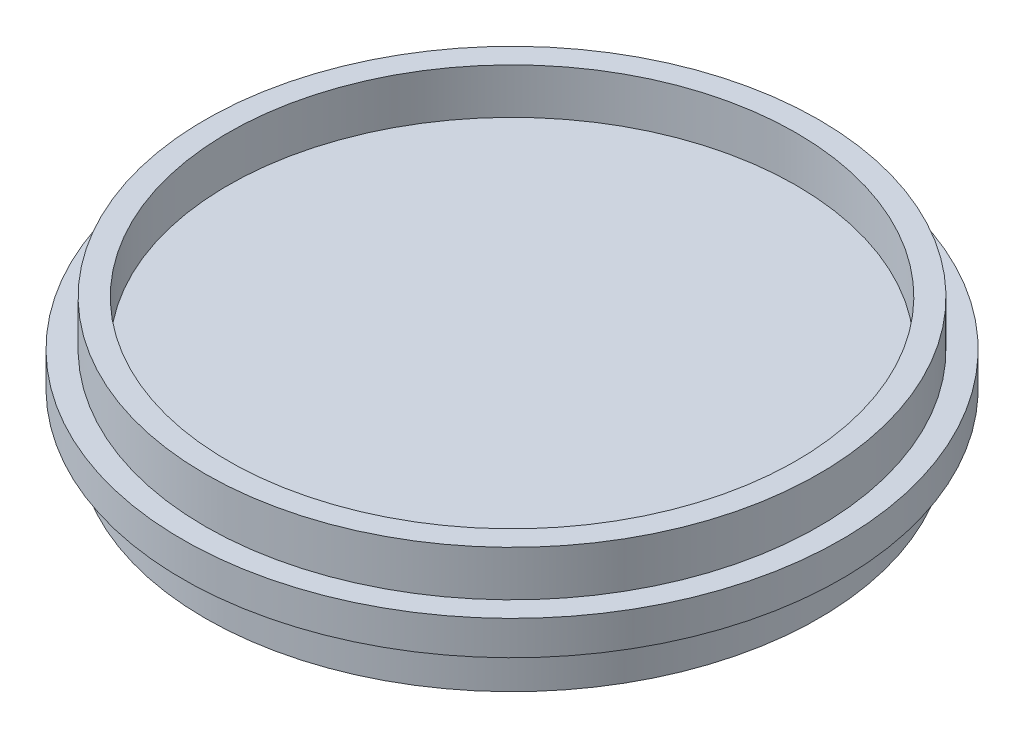
ISO-10303-21;
HEADER;
FILE_DESCRIPTION(('STEP AP214'),'2;1');
FILE_NAME('part.step','',(''),(''),'','','');
FILE_SCHEMA(('AUTOMOTIVE_DESIGN { 1 0 10303 214 1 1 1 1 }'));
ENDSEC;
DATA;
#1=APPLICATION_CONTEXT('core data for automotive mechanical design processes');
#2=APPLICATION_PROTOCOL_DEFINITION('international standard','automotive_design',2000,#1);
#3=PRODUCT_CONTEXT('',#1,'mechanical');
#4=PRODUCT('Part','Part','',(#3));
#5=PRODUCT_RELATED_PRODUCT_CATEGORY('part','',(#4));
#6=PRODUCT_DEFINITION_FORMATION('','',#4);
#7=PRODUCT_DEFINITION_CONTEXT('part definition',#1,'design');
#8=PRODUCT_DEFINITION('design','',#6,#7);
#9=PRODUCT_DEFINITION_SHAPE('','',#8);
#10=(LENGTH_UNIT() NAMED_UNIT(*) SI_UNIT(.MILLI.,.METRE.));
#11=(NAMED_UNIT(*) PLANE_ANGLE_UNIT() SI_UNIT($,.RADIAN.));
#12=(NAMED_UNIT(*) SI_UNIT($,.STERADIAN.) SOLID_ANGLE_UNIT());
#13=UNCERTAINTY_MEASURE_WITH_UNIT(LENGTH_MEASURE(1.E-05),#10,'distance_accuracy_value','');
#14=(GEOMETRIC_REPRESENTATION_CONTEXT(3) GLOBAL_UNCERTAINTY_ASSIGNED_CONTEXT((#13)) GLOBAL_UNIT_ASSIGNED_CONTEXT((#10,
#11,#12)) REPRESENTATION_CONTEXT('',''));
#15=CARTESIAN_POINT('',(0.,0.,0.));
#16=DIRECTION('',(0.,0.,1.));
#17=DIRECTION('',(1.,0.,0.));
#18=AXIS2_PLACEMENT_3D('',#15,#16,#17);
#19=CARTESIAN_POINT('',(63.8175,269.952427511005,-63.8175));
#20=DIRECTION('',(0.,-1.,0.));
#21=DIRECTION('',(0.,0.,-1.));
#22=AXIS2_PLACEMENT_3D('',#19,#20,#21);
#23=CYLINDRICAL_SURFACE('',#22,92.075);
#24=CARTESIAN_POINT('',(63.8175,9.52500000000001,-63.8175));
#25=DIRECTION('',(0.,-1.,0.));
#26=DIRECTION('',(0.,0.,-1.));
#27=AXIS2_PLACEMENT_3D('',#24,#25,#26);
#28=CIRCLE('',#27,92.075);
#29=CARTESIAN_POINT('',(63.8175,9.52500000000001,-155.8925));
#30=VERTEX_POINT('',#29);
#31=EDGE_CURVE('E52',#30,#30,#28,.F.);
#32=ORIENTED_EDGE('',*,*,#31,.F.);
#33=EDGE_LOOP('',(#32));
#34=FACE_BOUND('',#33,.T.);
#35=CARTESIAN_POINT('',(63.8175,0.,-63.8175));
#36=DIRECTION('',(0.,-1.,0.));
#37=DIRECTION('',(0.,0.,-1.));
#38=AXIS2_PLACEMENT_3D('',#35,#36,#37);
#39=CIRCLE('',#38,92.075);
#40=CARTESIAN_POINT('',(63.8175,0.,-155.8925));
#41=VERTEX_POINT('',#40);
#42=EDGE_CURVE('E57',#41,#41,#39,.T.);
#43=ORIENTED_EDGE('',*,*,#42,.F.);
#44=EDGE_LOOP('',(#43));
#45=FACE_BOUND('',#44,.T.);
#46=ADVANCED_FACE('F39',(#34,#45),#23,.T.);
#47=CARTESIAN_POINT('',(0.,9.525,0.));
#48=DIRECTION('',(0.,-1.,0.));
#49=DIRECTION('',(0.,0.,-1.));
#50=AXIS2_PLACEMENT_3D('',#47,#48,#49);
#51=PLANE('',#50);
#52=CARTESIAN_POINT('',(63.8175,9.525,-63.8175));
#53=DIRECTION('',(0.,-1.,0.));
#54=DIRECTION('',(0.,0.,-1.));
#55=AXIS2_PLACEMENT_3D('',#52,#53,#54);
#56=CIRCLE('',#55,85.725);
#57=CARTESIAN_POINT('',(63.8175,9.525,-149.5425));
#58=VERTEX_POINT('',#57);
#59=EDGE_CURVE('E76',#58,#58,#56,.T.);
#60=ORIENTED_EDGE('',*,*,#59,.T.);
#61=EDGE_LOOP('',(#60));
#62=FACE_BOUND('',#61,.T.);
#63=ORIENTED_EDGE('',*,*,#31,.T.);
#64=EDGE_LOOP('',(#63));
#65=FACE_BOUND('',#64,.T.);
#66=ADVANCED_FACE('F100',(#62,#65),#51,.F.);
#67=CARTESIAN_POINT('',(0.,0.,0.));
#68=DIRECTION('',(0.,-1.,0.));
#69=DIRECTION('',(0.,0.,-1.));
#70=AXIS2_PLACEMENT_3D('',#67,#68,#69);
#71=PLANE('',#70);
#72=CARTESIAN_POINT('',(63.8175,0.,-63.8175));
#73=DIRECTION('',(0.,-1.,0.));
#74=DIRECTION('',(0.,0.,-1.));
#75=AXIS2_PLACEMENT_3D('',#72,#73,#74);
#76=CIRCLE('',#75,85.725);
#77=CARTESIAN_POINT('',(63.8175,0.,-149.5425));
#78=VERTEX_POINT('',#77);
#79=EDGE_CURVE('E64',#78,#78,#76,.T.);
#80=ORIENTED_EDGE('',*,*,#79,.F.);
#81=EDGE_LOOP('',(#80));
#82=FACE_BOUND('',#81,.T.);
#83=ORIENTED_EDGE('',*,*,#42,.T.);
#84=EDGE_LOOP('',(#83));
#85=FACE_BOUND('',#84,.T.);
#86=ADVANCED_FACE('F41',(#82,#85),#71,.T.);
#87=CARTESIAN_POINT('',(63.8175,-12.7,-63.8175));
#88=DIRECTION('',(0.,-1.,0.));
#89=DIRECTION('',(0.,0.,-1.));
#90=AXIS2_PLACEMENT_3D('',#87,#88,#89);
#91=PLANE('',#90);
#92=CARTESIAN_POINT('',(63.8175,-12.7,-63.8175));
#93=DIRECTION('',(0.,-1.,0.));
#94=DIRECTION('',(0.,0.,-1.));
#95=AXIS2_PLACEMENT_3D('',#92,#93,#94);
#96=CIRCLE('',#95,85.725);
#97=CARTESIAN_POINT('',(63.8175,-12.7,-149.5425));
#98=VERTEX_POINT('',#97);
#99=EDGE_CURVE('E63',#98,#98,#96,.T.);
#100=ORIENTED_EDGE('',*,*,#99,.T.);
#101=EDGE_LOOP('',(#100));
#102=FACE_BOUND('',#101,.T.);
#103=CARTESIAN_POINT('',(63.8175,-12.7,-63.8175));
#104=DIRECTION('',(0.,-1.,0.));
#105=DIRECTION('',(0.,0.,-1.));
#106=AXIS2_PLACEMENT_3D('',#103,#104,#105);
#107=CIRCLE('',#106,79.375);
#108=CARTESIAN_POINT('',(63.8175,-12.7,-143.1925));
#109=VERTEX_POINT('',#108);
#110=EDGE_CURVE('E68',#109,#109,#107,.T.);
#111=ORIENTED_EDGE('',*,*,#110,.F.);
#112=EDGE_LOOP('',(#111));
#113=FACE_BOUND('',#112,.T.);
#114=ADVANCED_FACE('F117',(#102,#113),#91,.T.);
#115=CARTESIAN_POINT('',(63.8175,-12.7,-63.8175));
#116=DIRECTION('',(0.,1.,0.));
#117=DIRECTION('',(0.,0.,1.));
#118=AXIS2_PLACEMENT_3D('',#115,#116,#117);
#119=CYLINDRICAL_SURFACE('',#118,85.725);
#120=ORIENTED_EDGE('',*,*,#99,.F.);
#121=EDGE_LOOP('',(#120));
#122=FACE_BOUND('',#121,.T.);
#123=ORIENTED_EDGE('',*,*,#79,.T.);
#124=EDGE_LOOP('',(#123));
#125=FACE_BOUND('',#124,.T.);
#126=ADVANCED_FACE('F113',(#122,#125),#119,.T.);
#127=CARTESIAN_POINT('',(63.8175,-12.7,-63.8175));
#128=DIRECTION('',(0.,1.,0.));
#129=DIRECTION('',(0.,0.,1.));
#130=AXIS2_PLACEMENT_3D('',#127,#128,#129);
#131=CYLINDRICAL_SURFACE('',#130,79.375);
#132=ORIENTED_EDGE('',*,*,#110,.T.);
#133=EDGE_LOOP('',(#132));
#134=FACE_BOUND('',#133,.T.);
#135=CARTESIAN_POINT('',(63.8175,0.,-63.8175));
#136=DIRECTION('',(0.,-1.,0.));
#137=DIRECTION('',(0.,0.,-1.));
#138=AXIS2_PLACEMENT_3D('',#135,#136,#137);
#139=CIRCLE('',#138,79.375);
#140=CARTESIAN_POINT('',(63.8175,0.,-143.1925));
#141=VERTEX_POINT('',#140);
#142=EDGE_CURVE('E47',#141,#141,#139,.F.);
#143=ORIENTED_EDGE('',*,*,#142,.T.);
#144=EDGE_LOOP('',(#143));
#145=FACE_BOUND('',#144,.T.);
#146=ADVANCED_FACE('F116',(#134,#145),#131,.F.);
#147=ORIENTED_EDGE('',*,*,#142,.F.);
#148=EDGE_LOOP('',(#147));
#149=FACE_BOUND('',#148,.T.);
#150=ADVANCED_FACE('F124',(#149),#71,.T.);
#151=CARTESIAN_POINT('',(63.8175,22.225,-63.8175));
#152=DIRECTION('',(0.,-1.,0.));
#153=DIRECTION('',(0.,0.,-1.));
#154=AXIS2_PLACEMENT_3D('',#151,#152,#153);
#155=CYLINDRICAL_SURFACE('',#154,85.725);
#156=CARTESIAN_POINT('',(63.8175,22.225,-63.8175));
#157=DIRECTION('',(0.,-1.,0.));
#158=DIRECTION('',(0.,0.,-1.));
#159=AXIS2_PLACEMENT_3D('',#156,#157,#158);
#160=CIRCLE('',#159,85.725);
#161=CARTESIAN_POINT('',(63.8175,22.225,-149.5425));
#162=VERTEX_POINT('',#161);
#163=EDGE_CURVE('E75',#162,#162,#160,.T.);
#164=ORIENTED_EDGE('',*,*,#163,.T.);
#165=EDGE_LOOP('',(#164));
#166=FACE_BOUND('',#165,.T.);
#167=ORIENTED_EDGE('',*,*,#59,.F.);
#168=EDGE_LOOP('',(#167));
#169=FACE_BOUND('',#168,.T.);
#170=ADVANCED_FACE('F101',(#166,#169),#155,.T.);
#171=CARTESIAN_POINT('',(63.8175,22.225,-63.8175));
#172=DIRECTION('',(0.,1.,0.));
#173=DIRECTION('',(0.,0.,-1.));
#174=AXIS2_PLACEMENT_3D('',#171,#172,#173);
#175=PLANE('',#174);
#176=CARTESIAN_POINT('',(63.8175,22.225,-63.8175));
#177=DIRECTION('',(0.,-1.,0.));
#178=DIRECTION('',(0.,0.,-1.));
#179=AXIS2_PLACEMENT_3D('',#176,#177,#178);
#180=CIRCLE('',#179,79.375);
#181=CARTESIAN_POINT('',(63.8175,22.225,-143.1925));
#182=VERTEX_POINT('',#181);
#183=EDGE_CURVE('E80',#182,#182,#180,.T.);
#184=ORIENTED_EDGE('',*,*,#183,.T.);
#185=EDGE_LOOP('',(#184));
#186=FACE_BOUND('',#185,.T.);
#187=ORIENTED_EDGE('',*,*,#163,.F.);
#188=EDGE_LOOP('',(#187));
#189=FACE_BOUND('',#188,.T.);
#190=ADVANCED_FACE('F88',(#186,#189),#175,.T.);
#191=CARTESIAN_POINT('',(63.8175,22.225,-63.8175));
#192=DIRECTION('',(0.,-1.,0.));
#193=DIRECTION('',(0.,0.,-1.));
#194=AXIS2_PLACEMENT_3D('',#191,#192,#193);
#195=CYLINDRICAL_SURFACE('',#194,79.375);
#196=ORIENTED_EDGE('',*,*,#183,.F.);
#197=EDGE_LOOP('',(#196));
#198=FACE_BOUND('',#197,.T.);
#199=CARTESIAN_POINT('',(63.8175,9.525,-63.8175));
#200=DIRECTION('',(0.,-1.,0.));
#201=DIRECTION('',(0.,0.,-1.));
#202=AXIS2_PLACEMENT_3D('',#199,#200,#201);
#203=CIRCLE('',#202,79.375);
#204=CARTESIAN_POINT('',(63.8175,9.525,-143.1925));
#205=VERTEX_POINT('',#204);
#206=EDGE_CURVE('E10',#205,#205,#203,.T.);
#207=ORIENTED_EDGE('',*,*,#206,.T.);
#208=EDGE_LOOP('',(#207));
#209=FACE_BOUND('',#208,.T.);
#210=ADVANCED_FACE('F91',(#198,#209),#195,.F.);
#211=ORIENTED_EDGE('',*,*,#206,.F.);
#212=EDGE_LOOP('',(#211));
#213=FACE_BOUND('',#212,.T.);
#214=ADVANCED_FACE('F93',(#213),#51,.F.);
#215=CLOSED_SHELL('',(#46,#66,#86,#114,#126,#146,#150,#170,#190,#210,#214));
#216=MANIFOLD_SOLID_BREP('B2',#215);
#217=ADVANCED_BREP_SHAPE_REPRESENTATION('',(#18,#216),#14);
#218=SHAPE_DEFINITION_REPRESENTATION(#9,#217);
ENDSEC;
END-ISO-10303-21;
